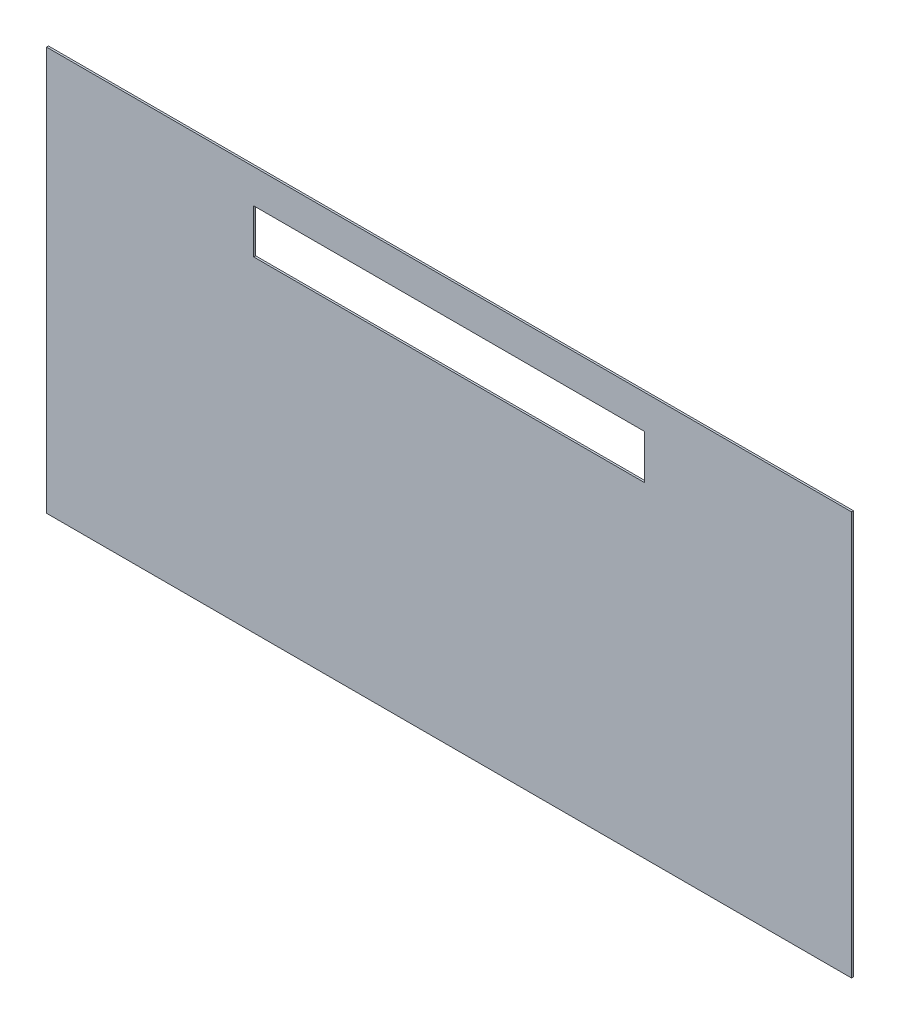
ISO-10303-21;
HEADER;
FILE_DESCRIPTION(('STEP AP214'),'2;1');
FILE_NAME('part.step','',(''),(''),'','','');
FILE_SCHEMA(('AUTOMOTIVE_DESIGN { 1 0 10303 214 1 1 1 1 }'));
ENDSEC;
DATA;
#1=APPLICATION_CONTEXT('core data for automotive mechanical design processes');
#2=APPLICATION_PROTOCOL_DEFINITION('international standard','automotive_design',2000,#1);
#3=PRODUCT_CONTEXT('',#1,'mechanical');
#4=PRODUCT('Part','Part','',(#3));
#5=PRODUCT_RELATED_PRODUCT_CATEGORY('part','',(#4));
#6=PRODUCT_DEFINITION_FORMATION('','',#4);
#7=PRODUCT_DEFINITION_CONTEXT('part definition',#1,'design');
#8=PRODUCT_DEFINITION('design','',#6,#7);
#9=PRODUCT_DEFINITION_SHAPE('','',#8);
#10=(LENGTH_UNIT() NAMED_UNIT(*) SI_UNIT(.MILLI.,.METRE.));
#11=(NAMED_UNIT(*) PLANE_ANGLE_UNIT() SI_UNIT($,.RADIAN.));
#12=(NAMED_UNIT(*) SI_UNIT($,.STERADIAN.) SOLID_ANGLE_UNIT());
#13=UNCERTAINTY_MEASURE_WITH_UNIT(LENGTH_MEASURE(1.E-05),#10,'distance_accuracy_value','');
#14=(GEOMETRIC_REPRESENTATION_CONTEXT(3) GLOBAL_UNCERTAINTY_ASSIGNED_CONTEXT((#13)) GLOBAL_UNIT_ASSIGNED_CONTEXT((#10,
#11,#12)) REPRESENTATION_CONTEXT('',''));
#15=CARTESIAN_POINT('',(0.,0.,0.));
#16=DIRECTION('',(0.,0.,1.));
#17=DIRECTION('',(1.,0.,0.));
#18=AXIS2_PLACEMENT_3D('',#15,#16,#17);
#19=CARTESIAN_POINT('',(0.,0.,40.));
#20=DIRECTION('',(0.,0.,-1.));
#21=DIRECTION('',(-1.,0.,0.));
#22=AXIS2_PLACEMENT_3D('',#19,#20,#21);
#23=PLANE('',#22);
#24=DIRECTION('',(0.,-1.,0.));
#25=VECTOR('',#24,1.);
#26=CARTESIAN_POINT('',(0.,0.,40.));
#27=LINE('',#26,#25);
#28=CARTESIAN_POINT('',(0.,310.,40.));
#29=VERTEX_POINT('',#28);
#30=CARTESIAN_POINT('',(0.,0.,40.));
#31=VERTEX_POINT('',#30);
#32=EDGE_CURVE('E126',#29,#31,#27,.T.);
#33=ORIENTED_EDGE('',*,*,#32,.T.);
#34=DIRECTION('',(1.,0.,0.));
#35=VECTOR('',#34,1.);
#36=CARTESIAN_POINT('',(0.,0.,40.));
#37=LINE('',#36,#35);
#38=CARTESIAN_POINT('',(618.,0.,40.));
#39=VERTEX_POINT('',#38);
#40=EDGE_CURVE('E129',#31,#39,#37,.T.);
#41=ORIENTED_EDGE('',*,*,#40,.T.);
#42=DIRECTION('',(0.,1.,0.));
#43=VECTOR('',#42,1.);
#44=CARTESIAN_POINT('',(618.,0.,40.));
#45=LINE('',#44,#43);
#46=CARTESIAN_POINT('',(618.,310.,40.));
#47=VERTEX_POINT('',#46);
#48=EDGE_CURVE('E132',#39,#47,#45,.T.);
#49=ORIENTED_EDGE('',*,*,#48,.T.);
#50=DIRECTION('',(-1.,0.,0.));
#51=VECTOR('',#50,1.);
#52=CARTESIAN_POINT('',(0.,310.,40.));
#53=LINE('',#52,#51);
#54=EDGE_CURVE('E134',#47,#29,#53,.T.);
#55=ORIENTED_EDGE('',*,*,#54,.T.);
#56=EDGE_LOOP('',(#33,#41,#49,#55));
#57=FACE_BOUND('',#56,.T.);
#58=DIRECTION('',(0.,-1.,0.));
#59=VECTOR('',#58,1.);
#60=CARTESIAN_POINT('',(159.,0.,40.));
#61=LINE('',#60,#59);
#62=CARTESIAN_POINT('',(159.,284.,40.));
#63=VERTEX_POINT('',#62);
#64=CARTESIAN_POINT('',(159.,250.,40.));
#65=VERTEX_POINT('',#64);
#66=EDGE_CURVE('E112',#63,#65,#61,.T.);
#67=ORIENTED_EDGE('',*,*,#66,.F.);
#68=DIRECTION('',(-1.,0.,0.));
#69=VECTOR('',#68,1.);
#70=CARTESIAN_POINT('',(0.,284.,40.));
#71=LINE('',#70,#69);
#72=CARTESIAN_POINT('',(459.,284.,40.));
#73=VERTEX_POINT('',#72);
#74=EDGE_CURVE('E101',#73,#63,#71,.T.);
#75=ORIENTED_EDGE('',*,*,#74,.F.);
#76=DIRECTION('',(0.,1.,0.));
#77=VECTOR('',#76,1.);
#78=CARTESIAN_POINT('',(459.,0.,40.));
#79=LINE('',#78,#77);
#80=CARTESIAN_POINT('',(459.,250.,40.));
#81=VERTEX_POINT('',#80);
#82=EDGE_CURVE('E106',#81,#73,#79,.T.);
#83=ORIENTED_EDGE('',*,*,#82,.F.);
#84=DIRECTION('',(1.,0.,0.));
#85=VECTOR('',#84,1.);
#86=CARTESIAN_POINT('',(0.,250.,40.));
#87=LINE('',#86,#85);
#88=EDGE_CURVE('E117',#65,#81,#87,.T.);
#89=ORIENTED_EDGE('',*,*,#88,.F.);
#90=EDGE_LOOP('',(#67,#75,#83,#89));
#91=FACE_BOUND('',#90,.T.);
#92=ADVANCED_FACE('F39',(#57,#91),#23,.F.);
#93=CARTESIAN_POINT('',(0.,0.,38.5));
#94=DIRECTION('',(0.,0.,-1.));
#95=DIRECTION('',(-1.,0.,0.));
#96=AXIS2_PLACEMENT_3D('',#93,#94,#95);
#97=PLANE('',#96);
#98=DIRECTION('',(0.,-1.,0.));
#99=VECTOR('',#98,1.);
#100=CARTESIAN_POINT('',(0.,0.,38.5));
#101=LINE('',#100,#99);
#102=CARTESIAN_POINT('',(0.,310.,38.5));
#103=VERTEX_POINT('',#102);
#104=CARTESIAN_POINT('',(0.,0.,38.5));
#105=VERTEX_POINT('',#104);
#106=EDGE_CURVE('E118',#103,#105,#101,.T.);
#107=ORIENTED_EDGE('',*,*,#106,.F.);
#108=DIRECTION('',(-1.,0.,0.));
#109=VECTOR('',#108,1.);
#110=CARTESIAN_POINT('',(0.,310.,38.5));
#111=LINE('',#110,#109);
#112=CARTESIAN_POINT('',(618.,310.,38.5));
#113=VERTEX_POINT('',#112);
#114=EDGE_CURVE('E130',#113,#103,#111,.T.);
#115=ORIENTED_EDGE('',*,*,#114,.F.);
#116=DIRECTION('',(0.,1.,0.));
#117=VECTOR('',#116,1.);
#118=CARTESIAN_POINT('',(618.,0.,38.5));
#119=LINE('',#118,#117);
#120=CARTESIAN_POINT('',(618.,0.,38.5));
#121=VERTEX_POINT('',#120);
#122=EDGE_CURVE('E138',#121,#113,#119,.T.);
#123=ORIENTED_EDGE('',*,*,#122,.F.);
#124=DIRECTION('',(1.,0.,0.));
#125=VECTOR('',#124,1.);
#126=CARTESIAN_POINT('',(0.,0.,38.5));
#127=LINE('',#126,#125);
#128=EDGE_CURVE('E121',#105,#121,#127,.T.);
#129=ORIENTED_EDGE('',*,*,#128,.F.);
#130=EDGE_LOOP('',(#107,#115,#123,#129));
#131=FACE_BOUND('',#130,.T.);
#132=DIRECTION('',(-1.,0.,0.));
#133=VECTOR('',#132,1.);
#134=CARTESIAN_POINT('',(0.,284.,38.5));
#135=LINE('',#134,#133);
#136=CARTESIAN_POINT('',(459.,284.,38.5));
#137=VERTEX_POINT('',#136);
#138=CARTESIAN_POINT('',(159.,284.,38.5));
#139=VERTEX_POINT('',#138);
#140=EDGE_CURVE('E152',#137,#139,#135,.T.);
#141=ORIENTED_EDGE('',*,*,#140,.T.);
#142=DIRECTION('',(0.,-1.,0.));
#143=VECTOR('',#142,1.);
#144=CARTESIAN_POINT('',(159.,0.,38.5));
#145=LINE('',#144,#143);
#146=CARTESIAN_POINT('',(159.,250.,38.5));
#147=VERTEX_POINT('',#146);
#148=EDGE_CURVE('E11',#139,#147,#145,.T.);
#149=ORIENTED_EDGE('',*,*,#148,.T.);
#150=DIRECTION('',(1.,0.,0.));
#151=VECTOR('',#150,1.);
#152=CARTESIAN_POINT('',(0.,250.,38.5));
#153=LINE('',#152,#151);
#154=CARTESIAN_POINT('',(459.,250.,38.5));
#155=VERTEX_POINT('',#154);
#156=EDGE_CURVE('E47',#147,#155,#153,.T.);
#157=ORIENTED_EDGE('',*,*,#156,.T.);
#158=DIRECTION('',(0.,1.,0.));
#159=VECTOR('',#158,1.);
#160=CARTESIAN_POINT('',(459.,0.,38.5));
#161=LINE('',#160,#159);
#162=EDGE_CURVE('E154',#155,#137,#161,.T.);
#163=ORIENTED_EDGE('',*,*,#162,.T.);
#164=EDGE_LOOP('',(#141,#149,#157,#163));
#165=FACE_BOUND('',#164,.T.);
#166=ADVANCED_FACE('F158',(#131,#165),#97,.T.);
#167=CARTESIAN_POINT('',(0.,0.,40.));
#168=DIRECTION('',(1.,0.,0.));
#169=DIRECTION('',(0.,0.,-1.));
#170=AXIS2_PLACEMENT_3D('',#167,#168,#169);
#171=PLANE('',#170);
#172=ORIENTED_EDGE('',*,*,#106,.T.);
#173=DIRECTION('',(0.,0.,-1.));
#174=VECTOR('',#173,1.);
#175=CARTESIAN_POINT('',(0.,0.,40.));
#176=LINE('',#175,#174);
#177=EDGE_CURVE('E149',#31,#105,#176,.T.);
#178=ORIENTED_EDGE('',*,*,#177,.F.);
#179=ORIENTED_EDGE('',*,*,#32,.F.);
#180=DIRECTION('',(0.,0.,-1.));
#181=VECTOR('',#180,1.);
#182=CARTESIAN_POINT('',(0.,310.,40.));
#183=LINE('',#182,#181);
#184=EDGE_CURVE('E135',#29,#103,#183,.T.);
#185=ORIENTED_EDGE('',*,*,#184,.T.);
#186=EDGE_LOOP('',(#172,#178,#179,#185));
#187=FACE_BOUND('',#186,.T.);
#188=ADVANCED_FACE('F41',(#187),#171,.F.);
#189=CARTESIAN_POINT('',(0.,0.,40.));
#190=DIRECTION('',(0.,1.,0.));
#191=DIRECTION('',(0.,0.,1.));
#192=AXIS2_PLACEMENT_3D('',#189,#190,#191);
#193=PLANE('',#192);
#194=ORIENTED_EDGE('',*,*,#128,.T.);
#195=DIRECTION('',(0.,0.,-1.));
#196=VECTOR('',#195,1.);
#197=CARTESIAN_POINT('',(618.,0.,40.));
#198=LINE('',#197,#196);
#199=EDGE_CURVE('E146',#39,#121,#198,.T.);
#200=ORIENTED_EDGE('',*,*,#199,.F.);
#201=ORIENTED_EDGE('',*,*,#40,.F.);
#202=ORIENTED_EDGE('',*,*,#177,.T.);
#203=EDGE_LOOP('',(#194,#200,#201,#202));
#204=FACE_BOUND('',#203,.T.);
#205=ADVANCED_FACE('F193',(#204),#193,.F.);
#206=CARTESIAN_POINT('',(618.,0.,40.));
#207=DIRECTION('',(-1.,0.,0.));
#208=DIRECTION('',(0.,0.,1.));
#209=AXIS2_PLACEMENT_3D('',#206,#207,#208);
#210=PLANE('',#209);
#211=ORIENTED_EDGE('',*,*,#122,.T.);
#212=DIRECTION('',(0.,0.,-1.));
#213=VECTOR('',#212,1.);
#214=CARTESIAN_POINT('',(618.,310.,40.));
#215=LINE('',#214,#213);
#216=EDGE_CURVE('E143',#47,#113,#215,.T.);
#217=ORIENTED_EDGE('',*,*,#216,.F.);
#218=ORIENTED_EDGE('',*,*,#48,.F.);
#219=ORIENTED_EDGE('',*,*,#199,.T.);
#220=EDGE_LOOP('',(#211,#217,#218,#219));
#221=FACE_BOUND('',#220,.T.);
#222=ADVANCED_FACE('F190',(#221),#210,.F.);
#223=CARTESIAN_POINT('',(0.,310.,40.));
#224=DIRECTION('',(0.,-1.,0.));
#225=DIRECTION('',(0.,0.,-1.));
#226=AXIS2_PLACEMENT_3D('',#223,#224,#225);
#227=PLANE('',#226);
#228=ORIENTED_EDGE('',*,*,#114,.T.);
#229=ORIENTED_EDGE('',*,*,#184,.F.);
#230=ORIENTED_EDGE('',*,*,#54,.F.);
#231=ORIENTED_EDGE('',*,*,#216,.T.);
#232=EDGE_LOOP('',(#228,#229,#230,#231));
#233=FACE_BOUND('',#232,.T.);
#234=ADVANCED_FACE('F188',(#233),#227,.F.);
#235=CARTESIAN_POINT('',(159.,250.,41.));
#236=DIRECTION('',(1.,0.,0.));
#237=DIRECTION('',(0.,0.,-1.));
#238=AXIS2_PLACEMENT_3D('',#235,#236,#237);
#239=PLANE('',#238);
#240=ORIENTED_EDGE('',*,*,#66,.T.);
#241=DIRECTION('',(0.,0.,-1.));
#242=VECTOR('',#241,1.);
#243=CARTESIAN_POINT('',(159.,250.,41.));
#244=LINE('',#243,#242);
#245=EDGE_CURVE('E107',#65,#147,#244,.T.);
#246=ORIENTED_EDGE('',*,*,#245,.T.);
#247=ORIENTED_EDGE('',*,*,#148,.F.);
#248=DIRECTION('',(0.,0.,-1.));
#249=VECTOR('',#248,1.);
#250=CARTESIAN_POINT('',(159.,284.,41.));
#251=LINE('',#250,#249);
#252=EDGE_CURVE('E59',#63,#139,#251,.T.);
#253=ORIENTED_EDGE('',*,*,#252,.F.);
#254=EDGE_LOOP('',(#240,#246,#247,#253));
#255=FACE_BOUND('',#254,.T.);
#256=ADVANCED_FACE('F110',(#255),#239,.T.);
#257=CARTESIAN_POINT('',(159.,250.,41.));
#258=DIRECTION('',(0.,1.,0.));
#259=DIRECTION('',(0.,0.,1.));
#260=AXIS2_PLACEMENT_3D('',#257,#258,#259);
#261=PLANE('',#260);
#262=ORIENTED_EDGE('',*,*,#88,.T.);
#263=DIRECTION('',(0.,0.,-1.));
#264=VECTOR('',#263,1.);
#265=CARTESIAN_POINT('',(459.,250.,41.));
#266=LINE('',#265,#264);
#267=EDGE_CURVE('E163',#81,#155,#266,.T.);
#268=ORIENTED_EDGE('',*,*,#267,.T.);
#269=ORIENTED_EDGE('',*,*,#156,.F.);
#270=ORIENTED_EDGE('',*,*,#245,.F.);
#271=EDGE_LOOP('',(#262,#268,#269,#270));
#272=FACE_BOUND('',#271,.T.);
#273=ADVANCED_FACE('F161',(#272),#261,.T.);
#274=CARTESIAN_POINT('',(459.,250.,41.));
#275=DIRECTION('',(-1.,0.,0.));
#276=DIRECTION('',(0.,0.,1.));
#277=AXIS2_PLACEMENT_3D('',#274,#275,#276);
#278=PLANE('',#277);
#279=ORIENTED_EDGE('',*,*,#82,.T.);
#280=DIRECTION('',(0.,0.,-1.));
#281=VECTOR('',#280,1.);
#282=CARTESIAN_POINT('',(459.,284.,41.));
#283=LINE('',#282,#281);
#284=EDGE_CURVE('E54',#73,#137,#283,.T.);
#285=ORIENTED_EDGE('',*,*,#284,.T.);
#286=ORIENTED_EDGE('',*,*,#162,.F.);
#287=ORIENTED_EDGE('',*,*,#267,.F.);
#288=EDGE_LOOP('',(#279,#285,#286,#287));
#289=FACE_BOUND('',#288,.T.);
#290=ADVANCED_FACE('F168',(#289),#278,.T.);
#291=CARTESIAN_POINT('',(159.,284.,41.));
#292=DIRECTION('',(0.,-1.,0.));
#293=DIRECTION('',(0.,0.,-1.));
#294=AXIS2_PLACEMENT_3D('',#291,#292,#293);
#295=PLANE('',#294);
#296=ORIENTED_EDGE('',*,*,#74,.T.);
#297=ORIENTED_EDGE('',*,*,#252,.T.);
#298=ORIENTED_EDGE('',*,*,#140,.F.);
#299=ORIENTED_EDGE('',*,*,#284,.F.);
#300=EDGE_LOOP('',(#296,#297,#298,#299));
#301=FACE_BOUND('',#300,.T.);
#302=ADVANCED_FACE('F102',(#301),#295,.T.);
#303=CLOSED_SHELL('',(#92,#166,#188,#205,#222,#234,#256,#273,#290,#302));
#304=MANIFOLD_SOLID_BREP('B2',#303);
#305=ADVANCED_BREP_SHAPE_REPRESENTATION('',(#18,#304),#14);
#306=SHAPE_DEFINITION_REPRESENTATION(#9,#305);
ENDSEC;
END-ISO-10303-21;
